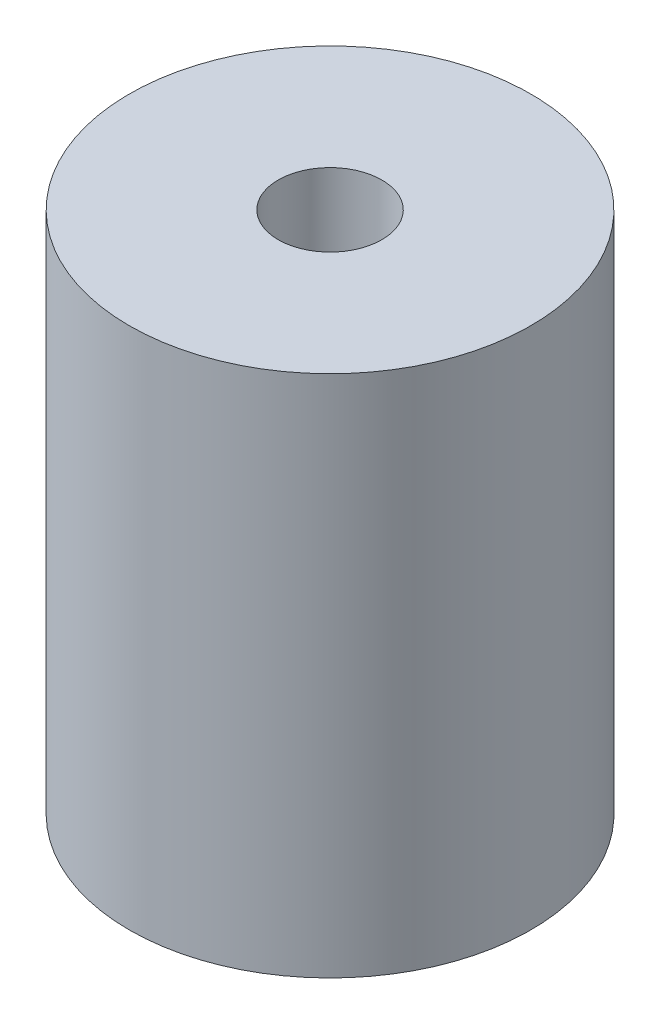
ISO-10303-21;
HEADER;
FILE_DESCRIPTION(('STEP AP214'),'2;1');
FILE_NAME('part.step','',(''),(''),'','','');
FILE_SCHEMA(('AUTOMOTIVE_DESIGN { 1 0 10303 214 1 1 1 1 }'));
ENDSEC;
DATA;
#1=APPLICATION_CONTEXT('core data for automotive mechanical design processes');
#2=APPLICATION_PROTOCOL_DEFINITION('international standard','automotive_design',2000,#1);
#3=PRODUCT_CONTEXT('',#1,'mechanical');
#4=PRODUCT('Part','Part','',(#3));
#5=PRODUCT_RELATED_PRODUCT_CATEGORY('part','',(#4));
#6=PRODUCT_DEFINITION_FORMATION('','',#4);
#7=PRODUCT_DEFINITION_CONTEXT('part definition',#1,'design');
#8=PRODUCT_DEFINITION('design','',#6,#7);
#9=PRODUCT_DEFINITION_SHAPE('','',#8);
#10=(LENGTH_UNIT() NAMED_UNIT(*) SI_UNIT(.MILLI.,.METRE.));
#11=(NAMED_UNIT(*) PLANE_ANGLE_UNIT() SI_UNIT($,.RADIAN.));
#12=(NAMED_UNIT(*) SI_UNIT($,.STERADIAN.) SOLID_ANGLE_UNIT());
#13=UNCERTAINTY_MEASURE_WITH_UNIT(LENGTH_MEASURE(1.E-05),#10,'distance_accuracy_value','');
#14=(GEOMETRIC_REPRESENTATION_CONTEXT(3) GLOBAL_UNCERTAINTY_ASSIGNED_CONTEXT((#13)) GLOBAL_UNIT_ASSIGNED_CONTEXT((#10,
#11,#12)) REPRESENTATION_CONTEXT('',''));
#15=CARTESIAN_POINT('',(0.,0.,0.));
#16=DIRECTION('',(0.,0.,1.));
#17=DIRECTION('',(1.,0.,0.));
#18=AXIS2_PLACEMENT_3D('',#15,#16,#17);
#19=CARTESIAN_POINT('',(0.,2.35,0.));
#20=DIRECTION('',(0.,1.,0.));
#21=DIRECTION('',(0.,0.,1.));
#22=AXIS2_PLACEMENT_3D('',#19,#20,#21);
#23=CYLINDRICAL_SURFACE('',#22,2.445);
#24=CARTESIAN_POINT('',(0.,12.35,0.));
#25=DIRECTION('',(0.,1.,0.));
#26=DIRECTION('',(0.,0.,1.));
#27=AXIS2_PLACEMENT_3D('',#24,#25,#26);
#28=CIRCLE('',#27,2.445);
#29=CARTESIAN_POINT('',(0.,12.35,2.445));
#30=VERTEX_POINT('',#29);
#31=EDGE_CURVE('E52',#30,#30,#28,.T.);
#32=ORIENTED_EDGE('',*,*,#31,.T.);
#33=EDGE_LOOP('',(#32));
#34=FACE_BOUND('',#33,.T.);
#35=CARTESIAN_POINT('',(0.,6.65,0.));
#36=DIRECTION('',(0.,-1.,0.));
#37=DIRECTION('',(0.,0.,-1.));
#38=AXIS2_PLACEMENT_3D('',#35,#36,#37);
#39=CIRCLE('',#38,2.445);
#40=CARTESIAN_POINT('',(0.,6.65,-2.445));
#41=VERTEX_POINT('',#40);
#42=EDGE_CURVE('E41',#41,#41,#39,.F.);
#43=ORIENTED_EDGE('',*,*,#42,.F.);
#44=EDGE_LOOP('',(#43));
#45=FACE_BOUND('',#44,.T.);
#46=ADVANCED_FACE('F37',(#34,#45),#23,.F.);
#47=CARTESIAN_POINT('',(0.,12.35,0.));
#48=DIRECTION('',(0.,-1.,0.));
#49=DIRECTION('',(0.,0.,-1.));
#50=AXIS2_PLACEMENT_3D('',#47,#48,#49);
#51=CYLINDRICAL_SURFACE('',#50,9.475);
#52=CARTESIAN_POINT('',(0.,12.35,0.));
#53=DIRECTION('',(0.,1.,0.));
#54=DIRECTION('',(0.,0.,1.));
#55=AXIS2_PLACEMENT_3D('',#52,#53,#54);
#56=CIRCLE('',#55,9.475);
#57=CARTESIAN_POINT('',(0.,12.35,9.475));
#58=VERTEX_POINT('',#57);
#59=EDGE_CURVE('E10',#58,#58,#56,.T.);
#60=ORIENTED_EDGE('',*,*,#59,.F.);
#61=EDGE_LOOP('',(#60));
#62=FACE_BOUND('',#61,.T.);
#63=CARTESIAN_POINT('',(0.,-12.35,0.));
#64=DIRECTION('',(0.,1.,0.));
#65=DIRECTION('',(0.,0.,1.));
#66=AXIS2_PLACEMENT_3D('',#63,#64,#65);
#67=CIRCLE('',#66,9.475);
#68=CARTESIAN_POINT('',(0.,-12.35,9.475));
#69=VERTEX_POINT('',#68);
#70=EDGE_CURVE('E46',#69,#69,#67,.T.);
#71=ORIENTED_EDGE('',*,*,#70,.T.);
#72=EDGE_LOOP('',(#71));
#73=FACE_BOUND('',#72,.T.);
#74=ADVANCED_FACE('F39',(#62,#73),#51,.T.);
#75=CARTESIAN_POINT('',(0.,12.35,0.));
#76=DIRECTION('',(0.,1.,0.));
#77=DIRECTION('',(0.,0.,1.));
#78=AXIS2_PLACEMENT_3D('',#75,#76,#77);
#79=PLANE('',#78);
#80=ORIENTED_EDGE('',*,*,#31,.F.);
#81=EDGE_LOOP('',(#80));
#82=FACE_BOUND('',#81,.T.);
#83=ORIENTED_EDGE('',*,*,#59,.T.);
#84=EDGE_LOOP('',(#83));
#85=FACE_BOUND('',#84,.T.);
#86=ADVANCED_FACE('F78',(#82,#85),#79,.T.);
#87=CARTESIAN_POINT('',(0.,-12.35,0.));
#88=DIRECTION('',(0.,1.,0.));
#89=DIRECTION('',(0.,0.,1.));
#90=AXIS2_PLACEMENT_3D('',#87,#88,#89);
#91=PLANE('',#90);
#92=CARTESIAN_POINT('',(0.,-12.35,0.));
#93=DIRECTION('',(0.,-1.,0.));
#94=DIRECTION('',(0.,0.,-1.));
#95=AXIS2_PLACEMENT_3D('',#92,#93,#94);
#96=CIRCLE('',#95,3.925);
#97=CARTESIAN_POINT('',(0.,-12.35,-3.925));
#98=VERTEX_POINT('',#97);
#99=EDGE_CURVE('E57',#98,#98,#96,.T.);
#100=ORIENTED_EDGE('',*,*,#99,.F.);
#101=EDGE_LOOP('',(#100));
#102=FACE_BOUND('',#101,.T.);
#103=ORIENTED_EDGE('',*,*,#70,.F.);
#104=EDGE_LOOP('',(#103));
#105=FACE_BOUND('',#104,.T.);
#106=ADVANCED_FACE('F85',(#102,#105),#91,.F.);
#107=CARTESIAN_POINT('',(0.,6.65,0.));
#108=DIRECTION('',(0.,-1.,0.));
#109=DIRECTION('',(0.,0.,-1.));
#110=AXIS2_PLACEMENT_3D('',#107,#108,#109);
#111=PLANE('',#110);
#112=CARTESIAN_POINT('',(0.,6.65,0.));
#113=DIRECTION('',(0.,-1.,0.));
#114=DIRECTION('',(0.,0.,-1.));
#115=AXIS2_PLACEMENT_3D('',#112,#113,#114);
#116=CIRCLE('',#115,3.925);
#117=CARTESIAN_POINT('',(0.,6.65,-3.925));
#118=VERTEX_POINT('',#117);
#119=EDGE_CURVE('E61',#118,#118,#116,.T.);
#120=ORIENTED_EDGE('',*,*,#119,.T.);
#121=EDGE_LOOP('',(#120));
#122=FACE_BOUND('',#121,.T.);
#123=ORIENTED_EDGE('',*,*,#42,.T.);
#124=EDGE_LOOP('',(#123));
#125=FACE_BOUND('',#124,.T.);
#126=ADVANCED_FACE('F70',(#122,#125),#111,.T.);
#127=CARTESIAN_POINT('',(0.,6.65,0.));
#128=DIRECTION('',(0.,-1.,0.));
#129=DIRECTION('',(0.,0.,-1.));
#130=AXIS2_PLACEMENT_3D('',#127,#128,#129);
#131=CYLINDRICAL_SURFACE('',#130,3.925);
#132=ORIENTED_EDGE('',*,*,#119,.F.);
#133=EDGE_LOOP('',(#132));
#134=FACE_BOUND('',#133,.T.);
#135=ORIENTED_EDGE('',*,*,#99,.T.);
#136=EDGE_LOOP('',(#135));
#137=FACE_BOUND('',#136,.T.);
#138=ADVANCED_FACE('F82',(#134,#137),#131,.F.);
#139=CLOSED_SHELL('',(#46,#74,#86,#106,#126,#138));
#140=MANIFOLD_SOLID_BREP('B2',#139);
#141=ADVANCED_BREP_SHAPE_REPRESENTATION('',(#18,#140),#14);
#142=SHAPE_DEFINITION_REPRESENTATION(#9,#141);
ENDSEC;
END-ISO-10303-21;
